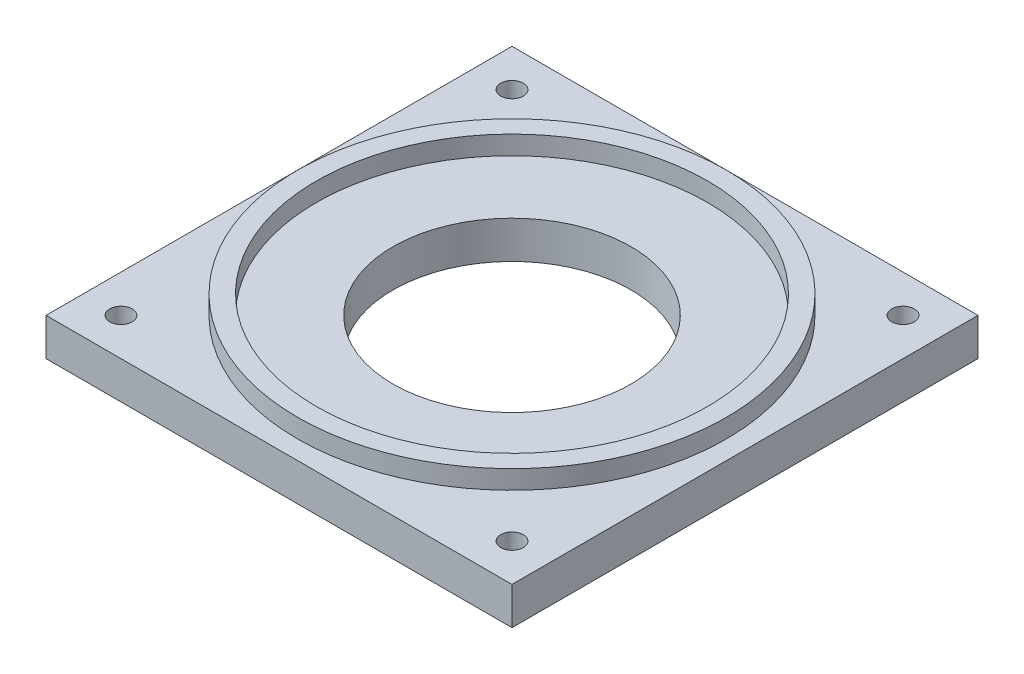
ISO-10303-21;
HEADER;
FILE_DESCRIPTION(('STEP AP214'),'2;1');
FILE_NAME('part.step','',(''),(''),'','','');
FILE_SCHEMA(('AUTOMOTIVE_DESIGN { 1 0 10303 214 1 1 1 1 }'));
ENDSEC;
DATA;
#1=APPLICATION_CONTEXT('core data for automotive mechanical design processes');
#2=APPLICATION_PROTOCOL_DEFINITION('international standard','automotive_design',2000,#1);
#3=PRODUCT_CONTEXT('',#1,'mechanical');
#4=PRODUCT('Part','Part','',(#3));
#5=PRODUCT_RELATED_PRODUCT_CATEGORY('part','',(#4));
#6=PRODUCT_DEFINITION_FORMATION('','',#4);
#7=PRODUCT_DEFINITION_CONTEXT('part definition',#1,'design');
#8=PRODUCT_DEFINITION('design','',#6,#7);
#9=PRODUCT_DEFINITION_SHAPE('','',#8);
#10=(LENGTH_UNIT() NAMED_UNIT(*) SI_UNIT(.MILLI.,.METRE.));
#11=(NAMED_UNIT(*) PLANE_ANGLE_UNIT() SI_UNIT($,.RADIAN.));
#12=(NAMED_UNIT(*) SI_UNIT($,.STERADIAN.) SOLID_ANGLE_UNIT());
#13=UNCERTAINTY_MEASURE_WITH_UNIT(LENGTH_MEASURE(1.E-05),#10,'distance_accuracy_value','');
#14=(GEOMETRIC_REPRESENTATION_CONTEXT(3) GLOBAL_UNCERTAINTY_ASSIGNED_CONTEXT((#13)) GLOBAL_UNIT_ASSIGNED_CONTEXT((#10,
#11,#12)) REPRESENTATION_CONTEXT('',''));
#15=CARTESIAN_POINT('',(0.,0.,0.));
#16=DIRECTION('',(0.,0.,1.));
#17=DIRECTION('',(1.,0.,0.));
#18=AXIS2_PLACEMENT_3D('',#15,#16,#17);
#19=CARTESIAN_POINT('',(-26.075,-0.00100000000000013,26.075));
#20=DIRECTION('',(0.,1.,0.));
#21=DIRECTION('',(0.,0.,1.));
#22=AXIS2_PLACEMENT_3D('',#19,#20,#21);
#23=CYLINDRICAL_SURFACE('',#22,1.5);
#24=CARTESIAN_POINT('',(-26.075,5.,26.075));
#25=DIRECTION('',(0.,1.,0.));
#26=DIRECTION('',(0.,0.,-1.));
#27=AXIS2_PLACEMENT_3D('',#24,#25,#26);
#28=CIRCLE('',#27,1.5);
#29=CARTESIAN_POINT('',(-26.075,5.,24.575));
#30=VERTEX_POINT('',#29);
#31=EDGE_CURVE('E173',#30,#30,#28,.T.);
#32=ORIENTED_EDGE('',*,*,#31,.T.);
#33=EDGE_LOOP('',(#32));
#34=FACE_BOUND('',#33,.T.);
#35=CARTESIAN_POINT('',(-26.075,2.,26.075));
#36=DIRECTION('',(0.,-1.,0.));
#37=DIRECTION('',(0.,0.,-1.));
#38=AXIS2_PLACEMENT_3D('',#35,#36,#37);
#39=CIRCLE('',#38,1.5);
#40=CARTESIAN_POINT('',(-26.075,2.,24.575));
#41=VERTEX_POINT('',#40);
#42=EDGE_CURVE('E137',#41,#41,#39,.F.);
#43=ORIENTED_EDGE('',*,*,#42,.F.);
#44=EDGE_LOOP('',(#43));
#45=FACE_BOUND('',#44,.T.);
#46=ADVANCED_FACE('F38',(#34,#45),#23,.F.);
#47=CARTESIAN_POINT('',(26.075,-0.00100000000000013,-26.075));
#48=DIRECTION('',(0.,1.,0.));
#49=DIRECTION('',(0.,0.,1.));
#50=AXIS2_PLACEMENT_3D('',#47,#48,#49);
#51=CYLINDRICAL_SURFACE('',#50,1.5);
#52=CARTESIAN_POINT('',(26.075,5.,-26.075));
#53=DIRECTION('',(0.,1.,0.));
#54=DIRECTION('',(0.,0.,-1.));
#55=AXIS2_PLACEMENT_3D('',#52,#53,#54);
#56=CIRCLE('',#55,1.5);
#57=CARTESIAN_POINT('',(26.075,5.,-27.575));
#58=VERTEX_POINT('',#57);
#59=EDGE_CURVE('E169',#58,#58,#56,.T.);
#60=ORIENTED_EDGE('',*,*,#59,.T.);
#61=EDGE_LOOP('',(#60));
#62=FACE_BOUND('',#61,.T.);
#63=CARTESIAN_POINT('',(26.075,2.,-26.075));
#64=DIRECTION('',(0.,-1.,0.));
#65=DIRECTION('',(0.,0.,-1.));
#66=AXIS2_PLACEMENT_3D('',#63,#64,#65);
#67=CIRCLE('',#66,1.5);
#68=CARTESIAN_POINT('',(26.075,2.,-27.575));
#69=VERTEX_POINT('',#68);
#70=EDGE_CURVE('E129',#69,#69,#67,.F.);
#71=ORIENTED_EDGE('',*,*,#70,.F.);
#72=EDGE_LOOP('',(#71));
#73=FACE_BOUND('',#72,.T.);
#74=ADVANCED_FACE('F213',(#62,#73),#51,.F.);
#75=CARTESIAN_POINT('',(31.075,5.,-31.075));
#76=DIRECTION('',(-1.,0.,0.));
#77=DIRECTION('',(0.,0.,1.));
#78=AXIS2_PLACEMENT_3D('',#75,#76,#77);
#79=PLANE('',#78);
#80=DIRECTION('',(0.,0.,-1.));
#81=VECTOR('',#80,1.);
#82=CARTESIAN_POINT('',(31.075,0.,-31.075));
#83=LINE('',#82,#81);
#84=CARTESIAN_POINT('',(31.075,0.,31.075));
#85=VERTEX_POINT('',#84);
#86=CARTESIAN_POINT('',(31.075,0.,-31.075));
#87=VERTEX_POINT('',#86);
#88=EDGE_CURVE('E112',#85,#87,#83,.T.);
#89=ORIENTED_EDGE('',*,*,#88,.T.);
#90=DIRECTION('',(0.,-1.,0.));
#91=VECTOR('',#90,1.);
#92=CARTESIAN_POINT('',(31.075,5.,-31.075));
#93=LINE('',#92,#91);
#94=CARTESIAN_POINT('',(31.075,5.,-31.075));
#95=VERTEX_POINT('',#94);
#96=EDGE_CURVE('E49',#95,#87,#93,.T.);
#97=ORIENTED_EDGE('',*,*,#96,.F.);
#98=DIRECTION('',(0.,0.,-1.));
#99=VECTOR('',#98,1.);
#100=CARTESIAN_POINT('',(31.075,5.,-31.075));
#101=LINE('',#100,#99);
#102=CARTESIAN_POINT('',(31.075,5.,31.075));
#103=VERTEX_POINT('',#102);
#104=EDGE_CURVE('E94',#103,#95,#101,.T.);
#105=ORIENTED_EDGE('',*,*,#104,.F.);
#106=DIRECTION('',(0.,-1.,0.));
#107=VECTOR('',#106,1.);
#108=CARTESIAN_POINT('',(31.075,5.,31.075));
#109=LINE('',#108,#107);
#110=EDGE_CURVE('E108',#103,#85,#109,.T.);
#111=ORIENTED_EDGE('',*,*,#110,.T.);
#112=EDGE_LOOP('',(#89,#97,#105,#111));
#113=FACE_BOUND('',#112,.T.);
#114=ADVANCED_FACE('F40',(#113),#79,.F.);
#115=CARTESIAN_POINT('',(-31.075,5.,-31.075));
#116=DIRECTION('',(0.,0.,1.));
#117=DIRECTION('',(1.,0.,0.));
#118=AXIS2_PLACEMENT_3D('',#115,#116,#117);
#119=PLANE('',#118);
#120=DIRECTION('',(-1.,0.,0.));
#121=VECTOR('',#120,1.);
#122=CARTESIAN_POINT('',(-31.075,0.,-31.075));
#123=LINE('',#122,#121);
#124=CARTESIAN_POINT('',(-31.075,0.,-31.075));
#125=VERTEX_POINT('',#124);
#126=EDGE_CURVE('E100',#87,#125,#123,.T.);
#127=ORIENTED_EDGE('',*,*,#126,.T.);
#128=DIRECTION('',(0.,-1.,0.));
#129=VECTOR('',#128,1.);
#130=CARTESIAN_POINT('',(-31.075,5.,-31.075));
#131=LINE('',#130,#129);
#132=CARTESIAN_POINT('',(-31.075,5.,-31.075));
#133=VERTEX_POINT('',#132);
#134=EDGE_CURVE('E98',#133,#125,#131,.T.);
#135=ORIENTED_EDGE('',*,*,#134,.F.);
#136=DIRECTION('',(-1.,0.,0.));
#137=VECTOR('',#136,1.);
#138=CARTESIAN_POINT('',(-31.075,5.,-31.075));
#139=LINE('',#138,#137);
#140=EDGE_CURVE('E89',#95,#133,#139,.T.);
#141=ORIENTED_EDGE('',*,*,#140,.F.);
#142=ORIENTED_EDGE('',*,*,#96,.T.);
#143=EDGE_LOOP('',(#127,#135,#141,#142));
#144=FACE_BOUND('',#143,.T.);
#145=ADVANCED_FACE('F99',(#144),#119,.F.);
#146=CARTESIAN_POINT('',(-31.075,5.,-31.075));
#147=DIRECTION('',(1.,0.,0.));
#148=DIRECTION('',(0.,0.,-1.));
#149=AXIS2_PLACEMENT_3D('',#146,#147,#148);
#150=PLANE('',#149);
#151=DIRECTION('',(0.,0.,1.));
#152=VECTOR('',#151,1.);
#153=CARTESIAN_POINT('',(-31.075,0.,-31.075));
#154=LINE('',#153,#152);
#155=CARTESIAN_POINT('',(-31.075,0.,31.075));
#156=VERTEX_POINT('',#155);
#157=EDGE_CURVE('E75',#125,#156,#154,.T.);
#158=ORIENTED_EDGE('',*,*,#157,.T.);
#159=DIRECTION('',(0.,-1.,0.));
#160=VECTOR('',#159,1.);
#161=CARTESIAN_POINT('',(-31.075,5.,31.075));
#162=LINE('',#161,#160);
#163=CARTESIAN_POINT('',(-31.075,5.,31.075));
#164=VERTEX_POINT('',#163);
#165=EDGE_CURVE('E102',#164,#156,#162,.T.);
#166=ORIENTED_EDGE('',*,*,#165,.F.);
#167=DIRECTION('',(0.,0.,1.));
#168=VECTOR('',#167,1.);
#169=CARTESIAN_POINT('',(-31.075,5.,-31.075));
#170=LINE('',#169,#168);
#171=EDGE_CURVE('E92',#133,#164,#170,.T.);
#172=ORIENTED_EDGE('',*,*,#171,.F.);
#173=ORIENTED_EDGE('',*,*,#134,.T.);
#174=EDGE_LOOP('',(#158,#166,#172,#173));
#175=FACE_BOUND('',#174,.T.);
#176=ADVANCED_FACE('F104',(#175),#150,.F.);
#177=CARTESIAN_POINT('',(-31.075,5.,31.075));
#178=DIRECTION('',(0.,0.,-1.));
#179=DIRECTION('',(-1.,0.,0.));
#180=AXIS2_PLACEMENT_3D('',#177,#178,#179);
#181=PLANE('',#180);
#182=DIRECTION('',(1.,0.,0.));
#183=VECTOR('',#182,1.);
#184=CARTESIAN_POINT('',(-31.075,0.,31.075));
#185=LINE('',#184,#183);
#186=EDGE_CURVE('E81',#156,#85,#185,.T.);
#187=ORIENTED_EDGE('',*,*,#186,.T.);
#188=ORIENTED_EDGE('',*,*,#110,.F.);
#189=DIRECTION('',(1.,0.,0.));
#190=VECTOR('',#189,1.);
#191=CARTESIAN_POINT('',(-31.075,5.,31.075));
#192=LINE('',#191,#190);
#193=EDGE_CURVE('E58',#164,#103,#192,.T.);
#194=ORIENTED_EDGE('',*,*,#193,.F.);
#195=ORIENTED_EDGE('',*,*,#165,.T.);
#196=EDGE_LOOP('',(#187,#188,#194,#195));
#197=FACE_BOUND('',#196,.T.);
#198=ADVANCED_FACE('F193',(#197),#181,.F.);
#199=CARTESIAN_POINT('',(0.,5.,0.));
#200=DIRECTION('',(0.,1.,0.));
#201=DIRECTION('',(0.,0.,1.));
#202=AXIS2_PLACEMENT_3D('',#199,#200,#201);
#203=PLANE('',#202);
#204=CARTESIAN_POINT('',(0.,5.,0.));
#205=DIRECTION('',(0.,1.,0.));
#206=DIRECTION('',(0.,0.,1.));
#207=AXIS2_PLACEMENT_3D('',#204,#205,#206);
#208=CIRCLE('',#207,28.575);
#209=CARTESIAN_POINT('',(0.,5.,28.575));
#210=VERTEX_POINT('',#209);
#211=EDGE_CURVE('E164',#210,#210,#208,.T.);
#212=ORIENTED_EDGE('',*,*,#211,.F.);
#213=EDGE_LOOP('',(#212));
#214=FACE_BOUND('',#213,.T.);
#215=ORIENTED_EDGE('',*,*,#59,.F.);
#216=EDGE_LOOP('',(#215));
#217=FACE_BOUND('',#216,.T.);
#218=CARTESIAN_POINT('',(26.075,5.,26.075));
#219=DIRECTION('',(0.,1.,0.));
#220=DIRECTION('',(0.,0.,1.));
#221=AXIS2_PLACEMENT_3D('',#218,#219,#220);
#222=CIRCLE('',#221,1.5);
#223=CARTESIAN_POINT('',(26.075,5.,27.575));
#224=VERTEX_POINT('',#223);
#225=EDGE_CURVE('E177',#224,#224,#222,.T.);
#226=ORIENTED_EDGE('',*,*,#225,.F.);
#227=EDGE_LOOP('',(#226));
#228=FACE_BOUND('',#227,.T.);
#229=ORIENTED_EDGE('',*,*,#31,.F.);
#230=EDGE_LOOP('',(#229));
#231=FACE_BOUND('',#230,.T.);
#232=CARTESIAN_POINT('',(-26.075,5.,-26.075));
#233=DIRECTION('',(0.,1.,0.));
#234=DIRECTION('',(0.,0.,1.));
#235=AXIS2_PLACEMENT_3D('',#232,#233,#234);
#236=CIRCLE('',#235,1.5);
#237=CARTESIAN_POINT('',(-26.075,5.,-24.575));
#238=VERTEX_POINT('',#237);
#239=EDGE_CURVE('E116',#238,#238,#236,.T.);
#240=ORIENTED_EDGE('',*,*,#239,.F.);
#241=EDGE_LOOP('',(#240));
#242=FACE_BOUND('',#241,.T.);
#243=ORIENTED_EDGE('',*,*,#104,.T.);
#244=ORIENTED_EDGE('',*,*,#140,.T.);
#245=ORIENTED_EDGE('',*,*,#171,.T.);
#246=ORIENTED_EDGE('',*,*,#193,.T.);
#247=EDGE_LOOP('',(#243,#244,#245,#246));
#248=FACE_BOUND('',#247,.T.);
#249=ADVANCED_FACE('F90',(#214,#217,#228,#231,#242,#248),#203,.T.);
#250=CARTESIAN_POINT('',(0.,0.,0.));
#251=DIRECTION('',(0.,1.,0.));
#252=DIRECTION('',(0.,0.,1.));
#253=AXIS2_PLACEMENT_3D('',#250,#251,#252);
#254=PLANE('',#253);
#255=CARTESIAN_POINT('',(26.075,0.,26.075));
#256=DIRECTION('',(0.,-1.,0.));
#257=DIRECTION('',(0.,0.,1.));
#258=AXIS2_PLACEMENT_3D('',#255,#256,#257);
#259=CIRCLE('',#258,3.);
#260=CARTESIAN_POINT('',(26.075,0.,29.075));
#261=VERTEX_POINT('',#260);
#262=EDGE_CURVE('E447',#261,#261,#259,.T.);
#263=ORIENTED_EDGE('',*,*,#262,.F.);
#264=EDGE_LOOP('',(#263));
#265=FACE_BOUND('',#264,.T.);
#266=CARTESIAN_POINT('',(26.075,0.,-26.075));
#267=DIRECTION('',(0.,-1.,0.));
#268=DIRECTION('',(0.,0.,-1.));
#269=AXIS2_PLACEMENT_3D('',#266,#267,#268);
#270=CIRCLE('',#269,3.);
#271=CARTESIAN_POINT('',(26.075,0.,-29.075));
#272=VERTEX_POINT('',#271);
#273=EDGE_CURVE('E437',#272,#272,#270,.T.);
#274=ORIENTED_EDGE('',*,*,#273,.F.);
#275=EDGE_LOOP('',(#274));
#276=FACE_BOUND('',#275,.T.);
#277=CARTESIAN_POINT('',(-26.075,0.,-26.075));
#278=DIRECTION('',(0.,-1.,0.));
#279=DIRECTION('',(0.,0.,1.));
#280=AXIS2_PLACEMENT_3D('',#277,#278,#279);
#281=CIRCLE('',#280,3.);
#282=CARTESIAN_POINT('',(-26.075,0.,-23.075));
#283=VERTEX_POINT('',#282);
#284=EDGE_CURVE('E428',#283,#283,#281,.T.);
#285=ORIENTED_EDGE('',*,*,#284,.F.);
#286=EDGE_LOOP('',(#285));
#287=FACE_BOUND('',#286,.T.);
#288=CARTESIAN_POINT('',(-26.075,0.,26.075));
#289=DIRECTION('',(0.,-1.,0.));
#290=DIRECTION('',(0.,0.,-1.));
#291=AXIS2_PLACEMENT_3D('',#288,#289,#290);
#292=CIRCLE('',#291,3.);
#293=CARTESIAN_POINT('',(-26.075,0.,23.075));
#294=VERTEX_POINT('',#293);
#295=EDGE_CURVE('E158',#294,#294,#292,.T.);
#296=ORIENTED_EDGE('',*,*,#295,.F.);
#297=EDGE_LOOP('',(#296));
#298=FACE_BOUND('',#297,.T.);
#299=CARTESIAN_POINT('',(0.,0.,0.));
#300=DIRECTION('',(0.,1.,0.));
#301=DIRECTION('',(0.,0.,1.));
#302=AXIS2_PLACEMENT_3D('',#299,#300,#301);
#303=CIRCLE('',#302,15.875);
#304=CARTESIAN_POINT('',(0.,0.,15.875));
#305=VERTEX_POINT('',#304);
#306=EDGE_CURVE('E149',#305,#305,#303,.F.);
#307=ORIENTED_EDGE('',*,*,#306,.F.);
#308=EDGE_LOOP('',(#307));
#309=FACE_BOUND('',#308,.T.);
#310=ORIENTED_EDGE('',*,*,#88,.F.);
#311=ORIENTED_EDGE('',*,*,#186,.F.);
#312=ORIENTED_EDGE('',*,*,#157,.F.);
#313=ORIENTED_EDGE('',*,*,#126,.F.);
#314=EDGE_LOOP('',(#310,#311,#312,#313));
#315=FACE_BOUND('',#314,.T.);
#316=ADVANCED_FACE('F192',(#265,#276,#287,#298,#309,#315),#254,.F.);
#317=CARTESIAN_POINT('',(-26.075,-0.00100000000000013,-26.075));
#318=DIRECTION('',(0.,1.,0.));
#319=DIRECTION('',(0.,0.,1.));
#320=AXIS2_PLACEMENT_3D('',#317,#318,#319);
#321=CYLINDRICAL_SURFACE('',#320,1.5);
#322=CARTESIAN_POINT('',(-26.075,2.,-26.075));
#323=DIRECTION('',(0.,1.,0.));
#324=DIRECTION('',(0.,0.,1.));
#325=AXIS2_PLACEMENT_3D('',#322,#323,#324);
#326=CIRCLE('',#325,1.5);
#327=CARTESIAN_POINT('',(-26.075,2.,-24.575));
#328=VERTEX_POINT('',#327);
#329=EDGE_CURVE('E42',#328,#328,#326,.F.);
#330=ORIENTED_EDGE('',*,*,#329,.T.);
#331=EDGE_LOOP('',(#330));
#332=FACE_BOUND('',#331,.T.);
#333=ORIENTED_EDGE('',*,*,#239,.T.);
#334=EDGE_LOOP('',(#333));
#335=FACE_BOUND('',#334,.T.);
#336=ADVANCED_FACE('F189',(#332,#335),#321,.F.);
#337=CARTESIAN_POINT('',(26.075,-0.00100000000000013,26.075));
#338=DIRECTION('',(0.,1.,0.));
#339=DIRECTION('',(0.,0.,1.));
#340=AXIS2_PLACEMENT_3D('',#337,#338,#339);
#341=CYLINDRICAL_SURFACE('',#340,1.5);
#342=CARTESIAN_POINT('',(26.075,2.,26.075));
#343=DIRECTION('',(0.,1.,0.));
#344=DIRECTION('',(0.,0.,1.));
#345=AXIS2_PLACEMENT_3D('',#342,#343,#344);
#346=CIRCLE('',#345,1.5);
#347=CARTESIAN_POINT('',(26.075,2.,27.575));
#348=VERTEX_POINT('',#347);
#349=EDGE_CURVE('E133',#348,#348,#346,.F.);
#350=ORIENTED_EDGE('',*,*,#349,.T.);
#351=EDGE_LOOP('',(#350));
#352=FACE_BOUND('',#351,.T.);
#353=ORIENTED_EDGE('',*,*,#225,.T.);
#354=EDGE_LOOP('',(#353));
#355=FACE_BOUND('',#354,.T.);
#356=ADVANCED_FACE('F227',(#352,#355),#341,.F.);
#357=CARTESIAN_POINT('',(0.,7.5,0.));
#358=DIRECTION('',(0.,1.,0.));
#359=DIRECTION('',(0.,0.,1.));
#360=AXIS2_PLACEMENT_3D('',#357,#358,#359);
#361=PLANE('',#360);
#362=CARTESIAN_POINT('',(0.,7.5,0.));
#363=DIRECTION('',(0.,1.,0.));
#364=DIRECTION('',(0.,0.,1.));
#365=AXIS2_PLACEMENT_3D('',#362,#363,#364);
#366=CIRCLE('',#365,28.575);
#367=CARTESIAN_POINT('',(0.,7.5,28.575));
#368=VERTEX_POINT('',#367);
#369=EDGE_CURVE('E165',#368,#368,#366,.T.);
#370=ORIENTED_EDGE('',*,*,#369,.T.);
#371=EDGE_LOOP('',(#370));
#372=FACE_BOUND('',#371,.T.);
#373=CARTESIAN_POINT('',(0.,7.5,0.));
#374=DIRECTION('',(0.,1.,0.));
#375=DIRECTION('',(0.,0.,1.));
#376=AXIS2_PLACEMENT_3D('',#373,#374,#375);
#377=CIRCLE('',#376,26.075);
#378=CARTESIAN_POINT('',(0.,7.5,26.075));
#379=VERTEX_POINT('',#378);
#380=EDGE_CURVE('E155',#379,#379,#377,.T.);
#381=ORIENTED_EDGE('',*,*,#380,.F.);
#382=EDGE_LOOP('',(#381));
#383=FACE_BOUND('',#382,.T.);
#384=ADVANCED_FACE('F229',(#372,#383),#361,.T.);
#385=CARTESIAN_POINT('',(0.,7.5,0.));
#386=DIRECTION('',(0.,-1.,0.));
#387=DIRECTION('',(0.,0.,-1.));
#388=AXIS2_PLACEMENT_3D('',#385,#386,#387);
#389=CYLINDRICAL_SURFACE('',#388,28.575);
#390=ORIENTED_EDGE('',*,*,#369,.F.);
#391=EDGE_LOOP('',(#390));
#392=FACE_BOUND('',#391,.T.);
#393=ORIENTED_EDGE('',*,*,#211,.T.);
#394=EDGE_LOOP('',(#393));
#395=FACE_BOUND('',#394,.T.);
#396=ADVANCED_FACE('F225',(#392,#395),#389,.T.);
#397=CARTESIAN_POINT('',(0.,7.5,0.));
#398=DIRECTION('',(0.,-1.,0.));
#399=DIRECTION('',(0.,0.,-1.));
#400=AXIS2_PLACEMENT_3D('',#397,#398,#399);
#401=CYLINDRICAL_SURFACE('',#400,26.075);
#402=ORIENTED_EDGE('',*,*,#380,.T.);
#403=EDGE_LOOP('',(#402));
#404=FACE_BOUND('',#403,.T.);
#405=CARTESIAN_POINT('',(0.,5.,0.));
#406=DIRECTION('',(0.,1.,0.));
#407=DIRECTION('',(0.,0.,1.));
#408=AXIS2_PLACEMENT_3D('',#405,#406,#407);
#409=CIRCLE('',#408,26.075);
#410=CARTESIAN_POINT('',(0.,5.,26.075));
#411=VERTEX_POINT('',#410);
#412=EDGE_CURVE('E11',#411,#411,#409,.F.);
#413=ORIENTED_EDGE('',*,*,#412,.T.);
#414=EDGE_LOOP('',(#413));
#415=FACE_BOUND('',#414,.T.);
#416=ADVANCED_FACE('F210',(#404,#415),#401,.F.);
#417=CARTESIAN_POINT('',(0.,5.,0.));
#418=DIRECTION('',(0.,1.,0.));
#419=DIRECTION('',(0.,0.,1.));
#420=AXIS2_PLACEMENT_3D('',#417,#418,#419);
#421=CIRCLE('',#420,15.875);
#422=CARTESIAN_POINT('',(0.,5.,15.875));
#423=VERTEX_POINT('',#422);
#424=EDGE_CURVE('E144',#423,#423,#421,.T.);
#425=ORIENTED_EDGE('',*,*,#424,.F.);
#426=EDGE_LOOP('',(#425));
#427=FACE_BOUND('',#426,.T.);
#428=ORIENTED_EDGE('',*,*,#412,.F.);
#429=EDGE_LOOP('',(#428));
#430=FACE_BOUND('',#429,.T.);
#431=ADVANCED_FACE('F196',(#427,#430),#203,.T.);
#432=CARTESIAN_POINT('',(0.,-0.00100000000000013,0.));
#433=DIRECTION('',(0.,1.,0.));
#434=DIRECTION('',(0.,0.,1.));
#435=AXIS2_PLACEMENT_3D('',#432,#433,#434);
#436=CYLINDRICAL_SURFACE('',#435,15.875);
#437=ORIENTED_EDGE('',*,*,#424,.T.);
#438=EDGE_LOOP('',(#437));
#439=FACE_BOUND('',#438,.T.);
#440=ORIENTED_EDGE('',*,*,#306,.T.);
#441=EDGE_LOOP('',(#440));
#442=FACE_BOUND('',#441,.T.);
#443=ADVANCED_FACE('F209',(#439,#442),#436,.F.);
#444=CARTESIAN_POINT('',(26.075,2.,-26.075));
#445=DIRECTION('',(0.,-1.,0.));
#446=DIRECTION('',(0.,0.,-1.));
#447=AXIS2_PLACEMENT_3D('',#444,#445,#446);
#448=PLANE('',#447);
#449=CARTESIAN_POINT('',(26.075,2.,-26.075));
#450=DIRECTION('',(0.,-1.,0.));
#451=DIRECTION('',(0.,0.,-1.));
#452=AXIS2_PLACEMENT_3D('',#449,#450,#451);
#453=CIRCLE('',#452,3.);
#454=CARTESIAN_POINT('',(26.075,2.,-29.075));
#455=VERTEX_POINT('',#454);
#456=EDGE_CURVE('E431',#455,#455,#453,.T.);
#457=ORIENTED_EDGE('',*,*,#456,.T.);
#458=EDGE_LOOP('',(#457));
#459=FACE_BOUND('',#458,.T.);
#460=ORIENTED_EDGE('',*,*,#70,.T.);
#461=EDGE_LOOP('',(#460));
#462=FACE_BOUND('',#461,.T.);
#463=ADVANCED_FACE('F243',(#459,#462),#448,.T.);
#464=CARTESIAN_POINT('',(26.075,2.,-26.075));
#465=DIRECTION('',(0.,-1.,0.));
#466=DIRECTION('',(0.,0.,-1.));
#467=AXIS2_PLACEMENT_3D('',#464,#465,#466);
#468=CYLINDRICAL_SURFACE('',#467,3.);
#469=ORIENTED_EDGE('',*,*,#456,.F.);
#470=EDGE_LOOP('',(#469));
#471=FACE_BOUND('',#470,.T.);
#472=ORIENTED_EDGE('',*,*,#273,.T.);
#473=EDGE_LOOP('',(#472));
#474=FACE_BOUND('',#473,.T.);
#475=ADVANCED_FACE('F248',(#471,#474),#468,.F.);
#476=CARTESIAN_POINT('',(26.075,2.,26.075));
#477=DIRECTION('',(0.,1.,0.));
#478=DIRECTION('',(0.,0.,1.));
#479=AXIS2_PLACEMENT_3D('',#476,#477,#478);
#480=PLANE('',#479);
#481=CARTESIAN_POINT('',(26.075,2.,26.075));
#482=DIRECTION('',(0.,-1.,0.));
#483=DIRECTION('',(0.,0.,1.));
#484=AXIS2_PLACEMENT_3D('',#481,#482,#483);
#485=CIRCLE('',#484,3.);
#486=CARTESIAN_POINT('',(26.075,2.,29.075));
#487=VERTEX_POINT('',#486);
#488=EDGE_CURVE('E443',#487,#487,#485,.T.);
#489=ORIENTED_EDGE('',*,*,#488,.T.);
#490=EDGE_LOOP('',(#489));
#491=FACE_BOUND('',#490,.T.);
#492=ORIENTED_EDGE('',*,*,#349,.F.);
#493=EDGE_LOOP('',(#492));
#494=FACE_BOUND('',#493,.T.);
#495=ADVANCED_FACE('F259',(#491,#494),#480,.F.);
#496=CARTESIAN_POINT('',(26.075,2.,26.075));
#497=DIRECTION('',(0.,-1.,0.));
#498=DIRECTION('',(0.,0.,-1.));
#499=AXIS2_PLACEMENT_3D('',#496,#497,#498);
#500=CYLINDRICAL_SURFACE('',#499,3.);
#501=ORIENTED_EDGE('',*,*,#488,.F.);
#502=EDGE_LOOP('',(#501));
#503=FACE_BOUND('',#502,.T.);
#504=ORIENTED_EDGE('',*,*,#262,.T.);
#505=EDGE_LOOP('',(#504));
#506=FACE_BOUND('',#505,.T.);
#507=ADVANCED_FACE('F269',(#503,#506),#500,.F.);
#508=CARTESIAN_POINT('',(-26.075,2.,26.075));
#509=DIRECTION('',(0.,-1.,0.));
#510=DIRECTION('',(0.,0.,-1.));
#511=AXIS2_PLACEMENT_3D('',#508,#509,#510);
#512=PLANE('',#511);
#513=CARTESIAN_POINT('',(-26.075,2.,26.075));
#514=DIRECTION('',(0.,-1.,0.));
#515=DIRECTION('',(0.,0.,-1.));
#516=AXIS2_PLACEMENT_3D('',#513,#514,#515);
#517=CIRCLE('',#516,3.);
#518=CARTESIAN_POINT('',(-26.075,2.,23.075));
#519=VERTEX_POINT('',#518);
#520=EDGE_CURVE('E134',#519,#519,#517,.T.);
#521=ORIENTED_EDGE('',*,*,#520,.T.);
#522=EDGE_LOOP('',(#521));
#523=FACE_BOUND('',#522,.T.);
#524=ORIENTED_EDGE('',*,*,#42,.T.);
#525=EDGE_LOOP('',(#524));
#526=FACE_BOUND('',#525,.T.);
#527=ADVANCED_FACE('F279',(#523,#526),#512,.T.);
#528=CARTESIAN_POINT('',(-26.075,2.,26.075));
#529=DIRECTION('',(0.,-1.,0.));
#530=DIRECTION('',(0.,0.,-1.));
#531=AXIS2_PLACEMENT_3D('',#528,#529,#530);
#532=CYLINDRICAL_SURFACE('',#531,3.);
#533=ORIENTED_EDGE('',*,*,#520,.F.);
#534=EDGE_LOOP('',(#533));
#535=FACE_BOUND('',#534,.T.);
#536=ORIENTED_EDGE('',*,*,#295,.T.);
#537=EDGE_LOOP('',(#536));
#538=FACE_BOUND('',#537,.T.);
#539=ADVANCED_FACE('F289',(#535,#538),#532,.F.);
#540=CARTESIAN_POINT('',(-26.075,2.,-26.075));
#541=DIRECTION('',(0.,1.,0.));
#542=DIRECTION('',(0.,0.,1.));
#543=AXIS2_PLACEMENT_3D('',#540,#541,#542);
#544=PLANE('',#543);
#545=CARTESIAN_POINT('',(-26.075,2.,-26.075));
#546=DIRECTION('',(0.,-1.,0.));
#547=DIRECTION('',(0.,0.,1.));
#548=AXIS2_PLACEMENT_3D('',#545,#546,#547);
#549=CIRCLE('',#548,3.);
#550=CARTESIAN_POINT('',(-26.075,2.,-23.075));
#551=VERTEX_POINT('',#550);
#552=EDGE_CURVE('E425',#551,#551,#549,.T.);
#553=ORIENTED_EDGE('',*,*,#552,.T.);
#554=EDGE_LOOP('',(#553));
#555=FACE_BOUND('',#554,.T.);
#556=ORIENTED_EDGE('',*,*,#329,.F.);
#557=EDGE_LOOP('',(#556));
#558=FACE_BOUND('',#557,.T.);
#559=ADVANCED_FACE('F299',(#555,#558),#544,.F.);
#560=CARTESIAN_POINT('',(-26.075,2.,-26.075));
#561=DIRECTION('',(0.,-1.,0.));
#562=DIRECTION('',(0.,0.,-1.));
#563=AXIS2_PLACEMENT_3D('',#560,#561,#562);
#564=CYLINDRICAL_SURFACE('',#563,3.);
#565=ORIENTED_EDGE('',*,*,#552,.F.);
#566=EDGE_LOOP('',(#565));
#567=FACE_BOUND('',#566,.T.);
#568=ORIENTED_EDGE('',*,*,#284,.T.);
#569=EDGE_LOOP('',(#568));
#570=FACE_BOUND('',#569,.T.);
#571=ADVANCED_FACE('F309',(#567,#570),#564,.F.);
#572=CLOSED_SHELL('',(#46,#74,#114,#145,#176,#198,#249,#316,#336,#356,#384,#396,#416,#431,#443,
#463,#475,#495,#507,#527,#539,#559,#571));
#573=MANIFOLD_SOLID_BREP('B2',#572);
#574=ADVANCED_BREP_SHAPE_REPRESENTATION('',(#18,#573),#14);
#575=SHAPE_DEFINITION_REPRESENTATION(#9,#574);
ENDSEC;
END-ISO-10303-21;
